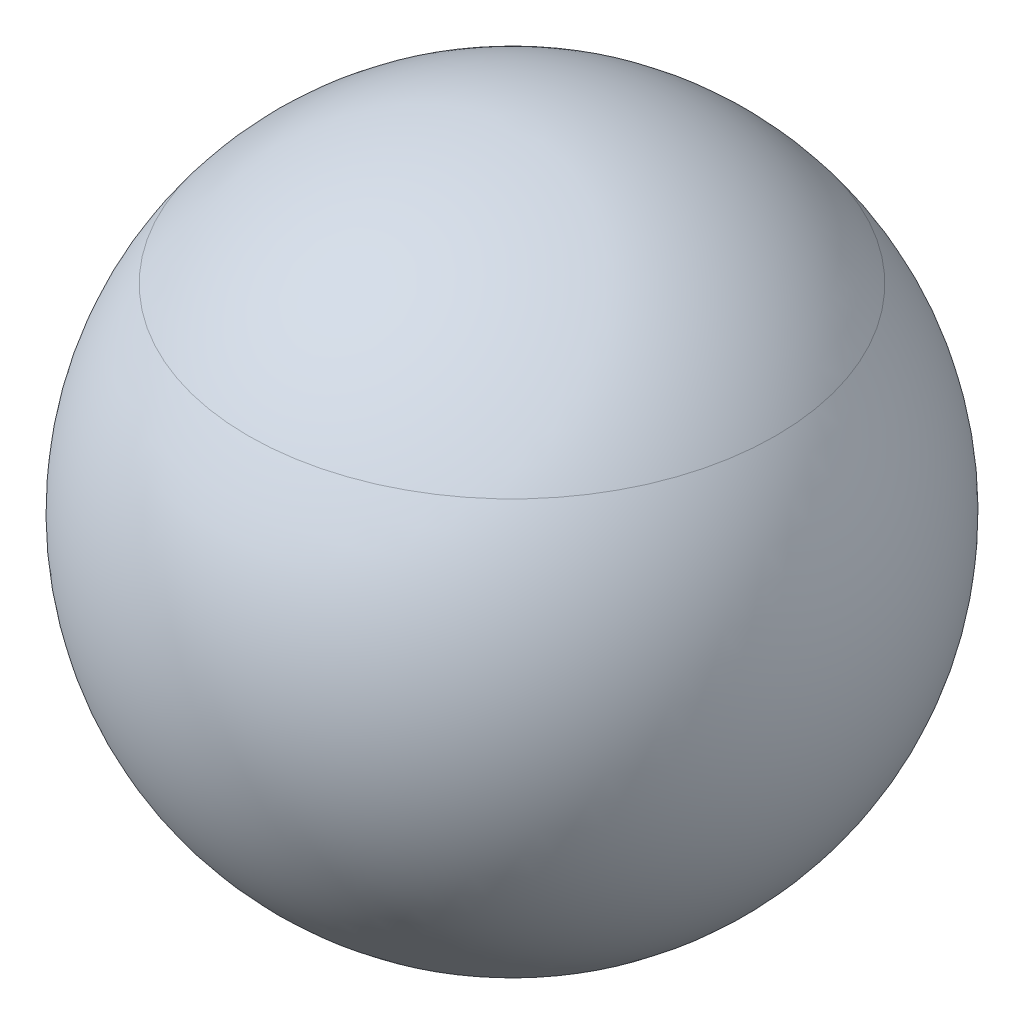
ISO-10303-21;
HEADER;
FILE_DESCRIPTION(('STEP AP214'),'2;1');
FILE_NAME('part.step','',(''),(''),'','','');
FILE_SCHEMA(('AUTOMOTIVE_DESIGN { 1 0 10303 214 1 1 1 1 }'));
ENDSEC;
DATA;
#1=APPLICATION_CONTEXT('core data for automotive mechanical design processes');
#2=APPLICATION_PROTOCOL_DEFINITION('international standard','automotive_design',2000,#1);
#3=PRODUCT_CONTEXT('',#1,'mechanical');
#4=PRODUCT('Part','Part','',(#3));
#5=PRODUCT_RELATED_PRODUCT_CATEGORY('part','',(#4));
#6=PRODUCT_DEFINITION_FORMATION('','',#4);
#7=PRODUCT_DEFINITION_CONTEXT('part definition',#1,'design');
#8=PRODUCT_DEFINITION('design','',#6,#7);
#9=PRODUCT_DEFINITION_SHAPE('','',#8);
#10=(LENGTH_UNIT() NAMED_UNIT(*) SI_UNIT(.MILLI.,.METRE.));
#11=(NAMED_UNIT(*) PLANE_ANGLE_UNIT() SI_UNIT($,.RADIAN.));
#12=(NAMED_UNIT(*) SI_UNIT($,.STERADIAN.) SOLID_ANGLE_UNIT());
#13=UNCERTAINTY_MEASURE_WITH_UNIT(LENGTH_MEASURE(1.E-05),#10,'distance_accuracy_value','');
#14=(GEOMETRIC_REPRESENTATION_CONTEXT(3) GLOBAL_UNCERTAINTY_ASSIGNED_CONTEXT((#13)) GLOBAL_UNIT_ASSIGNED_CONTEXT((#10,
#11,#12)) REPRESENTATION_CONTEXT('',''));
#15=CARTESIAN_POINT('',(0.,0.,0.));
#16=DIRECTION('',(0.,0.,1.));
#17=DIRECTION('',(1.,0.,0.));
#18=AXIS2_PLACEMENT_3D('',#15,#16,#17);
#19=CARTESIAN_POINT('',(0.,24.,0.));
#20=DIRECTION('',(0.,1.,0.));
#21=DIRECTION('',(0.,0.,1.));
#22=AXIS2_PLACEMENT_3D('',#19,#20,#21);
#23=PLANE('',#22);
#24=CARTESIAN_POINT('',(0.,24.,0.));
#25=DIRECTION('',(0.,1.,0.));
#26=DIRECTION('',(0.,0.,1.));
#27=AXIS2_PLACEMENT_3D('',#24,#25,#26);
#28=CIRCLE('',#27,12.);
#29=CARTESIAN_POINT('',(0.,24.,12.));
#30=VERTEX_POINT('',#29);
#31=EDGE_CURVE('E11',#30,#30,#28,.T.);
#32=ORIENTED_EDGE('',*,*,#31,.T.);
#33=EDGE_LOOP('',(#32));
#34=FACE_BOUND('',#33,.T.);
#35=ADVANCED_FACE('F39',(#34),#23,.T.);
#36=CARTESIAN_POINT('',(0.,15.,0.));
#37=DIRECTION('',(0.,1.,0.));
#38=DIRECTION('',(1.,0.,0.));
#39=AXIS2_PLACEMENT_3D('',#36,#37,#38);
#40=SPHERICAL_SURFACE('',#39,15.);
#41=ORIENTED_EDGE('',*,*,#31,.F.);
#42=EDGE_LOOP('',(#41));
#43=FACE_BOUND('',#42,.T.);
#44=ADVANCED_FACE('F41',(#43),#40,.T.);
#45=CLOSED_SHELL('',(#35,#44));
#46=MANIFOLD_SOLID_BREP('B2',#45);
#47=CARTESIAN_POINT('',(0.,24.,0.));
#48=DIRECTION('',(0.,1.,0.));
#49=DIRECTION('',(0.,0.,1.));
#50=AXIS2_PLACEMENT_3D('',#47,#48,#49);
#51=PLANE('',#50);
#52=CARTESIAN_POINT('',(0.,24.,0.));
#53=DIRECTION('',(0.,1.,0.));
#54=DIRECTION('',(0.,0.,1.));
#55=AXIS2_PLACEMENT_3D('',#52,#53,#54);
#56=CIRCLE('',#55,12.);
#57=CARTESIAN_POINT('',(0.,24.,12.));
#58=VERTEX_POINT('',#57);
#59=EDGE_CURVE('E38',#58,#58,#56,.T.);
#60=ORIENTED_EDGE('',*,*,#59,.F.);
#61=EDGE_LOOP('',(#60));
#62=FACE_BOUND('',#61,.T.);
#63=ADVANCED_FACE('F65',(#62),#51,.F.);
#64=CARTESIAN_POINT('',(0.,15.,0.));
#65=DIRECTION('',(0.,1.,0.));
#66=DIRECTION('',(1.,0.,0.));
#67=AXIS2_PLACEMENT_3D('',#64,#65,#66);
#68=SPHERICAL_SURFACE('',#67,15.);
#69=ORIENTED_EDGE('',*,*,#59,.T.);
#70=EDGE_LOOP('',(#69));
#71=FACE_BOUND('',#70,.T.);
#72=ADVANCED_FACE('F72',(#71),#68,.T.);
#73=CLOSED_SHELL('',(#63,#72));
#74=MANIFOLD_SOLID_BREP('B6',#73);
#75=ADVANCED_BREP_SHAPE_REPRESENTATION('',(#18,#46,#74),#14);
#76=SHAPE_DEFINITION_REPRESENTATION(#9,#75);
ENDSEC;
END-ISO-10303-21;
